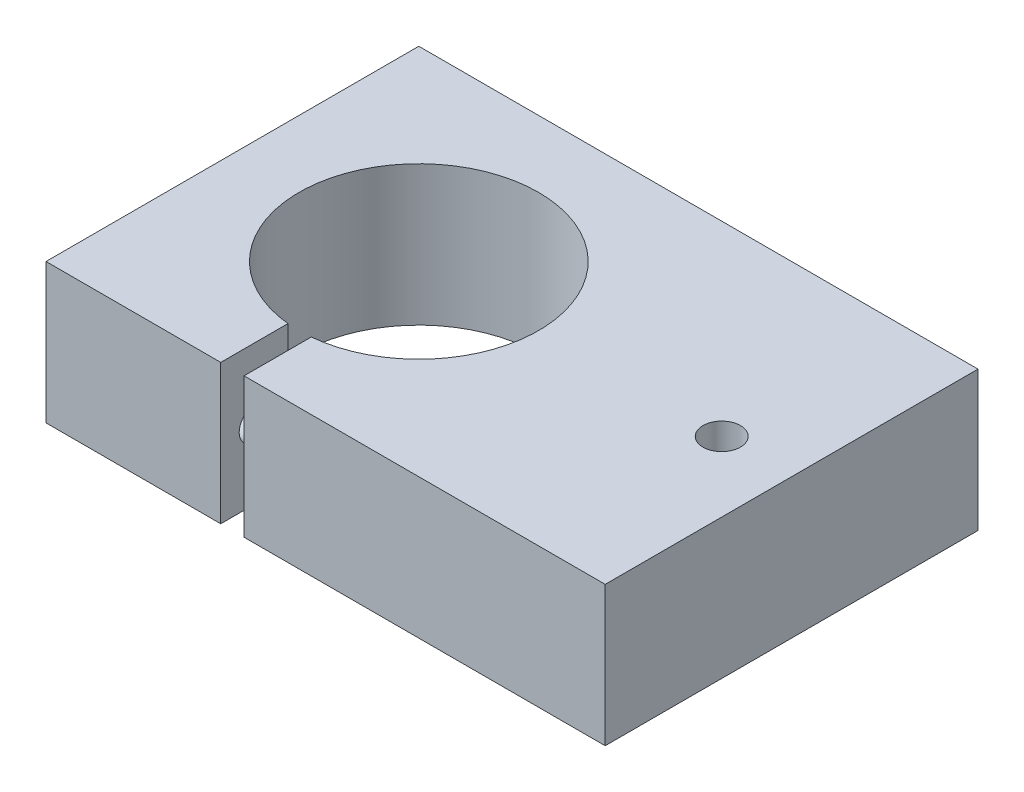
ISO-10303-21;
HEADER;
FILE_DESCRIPTION(('STEP AP214'),'2;1');
FILE_NAME('part.step','',(''),(''),'','','');
FILE_SCHEMA(('AUTOMOTIVE_DESIGN { 1 0 10303 214 1 1 1 1 }'));
ENDSEC;
DATA;
#1=APPLICATION_CONTEXT('core data for automotive mechanical design processes');
#2=APPLICATION_PROTOCOL_DEFINITION('international standard','automotive_design',2000,#1);
#3=PRODUCT_CONTEXT('',#1,'mechanical');
#4=PRODUCT('Part','Part','',(#3));
#5=PRODUCT_RELATED_PRODUCT_CATEGORY('part','',(#4));
#6=PRODUCT_DEFINITION_FORMATION('','',#4);
#7=PRODUCT_DEFINITION_CONTEXT('part definition',#1,'design');
#8=PRODUCT_DEFINITION('design','',#6,#7);
#9=PRODUCT_DEFINITION_SHAPE('','',#8);
#10=(LENGTH_UNIT() NAMED_UNIT(*) SI_UNIT(.MILLI.,.METRE.));
#11=(NAMED_UNIT(*) PLANE_ANGLE_UNIT() SI_UNIT($,.RADIAN.));
#12=(NAMED_UNIT(*) SI_UNIT($,.STERADIAN.) SOLID_ANGLE_UNIT());
#13=UNCERTAINTY_MEASURE_WITH_UNIT(LENGTH_MEASURE(1.E-05),#10,'distance_accuracy_value','');
#14=(GEOMETRIC_REPRESENTATION_CONTEXT(3) GLOBAL_UNCERTAINTY_ASSIGNED_CONTEXT((#13)) GLOBAL_UNIT_ASSIGNED_CONTEXT((#10,
#11,#12)) REPRESENTATION_CONTEXT('',''));
#15=CARTESIAN_POINT('',(0.,0.,0.));
#16=DIRECTION('',(0.,0.,1.));
#17=DIRECTION('',(1.,0.,0.));
#18=AXIS2_PLACEMENT_3D('',#15,#16,#17);
#19=CARTESIAN_POINT('',(-38.1,9.525,25.4));
#20=DIRECTION('',(0.,0.,-1.));
#21=DIRECTION('',(-1.,0.,0.));
#22=AXIS2_PLACEMENT_3D('',#19,#20,#21);
#23=PLANE('',#22);
#24=DIRECTION('',(1.,0.,0.));
#25=VECTOR('',#24,1.);
#26=CARTESIAN_POINT('',(-38.1,-9.525,25.4));
#27=LINE('',#26,#25);
#28=CARTESIAN_POINT('',(-38.1,-9.525,25.4));
#29=VERTEX_POINT('',#28);
#30=CARTESIAN_POINT('',(-14.2875,-9.525,25.4));
#31=VERTEX_POINT('',#30);
#32=EDGE_CURVE('E177',#29,#31,#27,.T.);
#33=ORIENTED_EDGE('',*,*,#32,.T.);
#34=DIRECTION('',(0.,1.,0.));
#35=VECTOR('',#34,1.);
#36=CARTESIAN_POINT('',(-14.2875,9.525,25.4));
#37=LINE('',#36,#35);
#38=CARTESIAN_POINT('',(-14.2875,9.525,25.4));
#39=VERTEX_POINT('',#38);
#40=EDGE_CURVE('E159',#31,#39,#37,.T.);
#41=ORIENTED_EDGE('',*,*,#40,.T.);
#42=DIRECTION('',(1.,0.,0.));
#43=VECTOR('',#42,1.);
#44=CARTESIAN_POINT('',(-38.1,9.525,25.4));
#45=LINE('',#44,#43);
#46=CARTESIAN_POINT('',(-38.1,9.525,25.4));
#47=VERTEX_POINT('',#46);
#48=EDGE_CURVE('E185',#47,#39,#45,.T.);
#49=ORIENTED_EDGE('',*,*,#48,.F.);
#50=DIRECTION('',(0.,-1.,0.));
#51=VECTOR('',#50,1.);
#52=CARTESIAN_POINT('',(-38.1,9.525,25.4));
#53=LINE('',#52,#51);
#54=EDGE_CURVE('E205',#47,#29,#53,.T.);
#55=ORIENTED_EDGE('',*,*,#54,.T.);
#56=EDGE_LOOP('',(#33,#41,#49,#55));
#57=FACE_BOUND('',#56,.T.);
#58=ADVANCED_FACE('F43',(#57),#23,.F.);
#59=CARTESIAN_POINT('',(-38.1,9.525,25.4));
#60=DIRECTION('',(-1.,0.,0.));
#61=DIRECTION('',(0.,0.,1.));
#62=AXIS2_PLACEMENT_3D('',#59,#60,#61);
#63=PLANE('',#62);
#64=CARTESIAN_POINT('',(-38.1,0.,20.6375));
#65=DIRECTION('',(-1.,0.,0.));
#66=DIRECTION('',(0.,0.,1.));
#67=AXIS2_PLACEMENT_3D('',#64,#65,#66);
#68=CIRCLE('',#67,3.96875);
#69=CARTESIAN_POINT('',(-38.1,0.,24.60625));
#70=VERTEX_POINT('',#69);
#71=EDGE_CURVE('E120',#70,#70,#68,.T.);
#72=ORIENTED_EDGE('',*,*,#71,.F.);
#73=EDGE_LOOP('',(#72));
#74=FACE_BOUND('',#73,.T.);
#75=DIRECTION('',(0.,0.,-1.));
#76=VECTOR('',#75,1.);
#77=CARTESIAN_POINT('',(-38.1,-9.525,25.4));
#78=LINE('',#77,#76);
#79=CARTESIAN_POINT('',(-38.1,-9.525,-25.4));
#80=VERTEX_POINT('',#79);
#81=EDGE_CURVE('E168',#29,#80,#78,.T.);
#82=ORIENTED_EDGE('',*,*,#81,.F.);
#83=ORIENTED_EDGE('',*,*,#54,.F.);
#84=DIRECTION('',(0.,0.,-1.));
#85=VECTOR('',#84,1.);
#86=CARTESIAN_POINT('',(-38.1,9.525,25.4));
#87=LINE('',#86,#85);
#88=CARTESIAN_POINT('',(-38.1,9.525,-25.4));
#89=VERTEX_POINT('',#88);
#90=EDGE_CURVE('E172',#47,#89,#87,.T.);
#91=ORIENTED_EDGE('',*,*,#90,.T.);
#92=DIRECTION('',(0.,-1.,0.));
#93=VECTOR('',#92,1.);
#94=CARTESIAN_POINT('',(-38.1,9.525,-25.4));
#95=LINE('',#94,#93);
#96=EDGE_CURVE('E189',#89,#80,#95,.T.);
#97=ORIENTED_EDGE('',*,*,#96,.T.);
#98=EDGE_LOOP('',(#82,#83,#91,#97));
#99=FACE_BOUND('',#98,.T.);
#100=ADVANCED_FACE('F45',(#74,#99),#63,.T.);
#101=CARTESIAN_POINT('',(-11.1125,9.525,25.4));
#102=VERTEX_POINT('',#101);
#103=CARTESIAN_POINT('',(38.1,9.525,25.4));
#104=VERTEX_POINT('',#103);
#105=EDGE_CURVE('E184',#102,#104,#45,.T.);
#106=ORIENTED_EDGE('',*,*,#105,.F.);
#107=DIRECTION('',(0.,-1.,0.));
#108=VECTOR('',#107,1.);
#109=CARTESIAN_POINT('',(-11.1125,9.525,25.4));
#110=LINE('',#109,#108);
#111=CARTESIAN_POINT('',(-11.1125,-9.525,25.4));
#112=VERTEX_POINT('',#111);
#113=EDGE_CURVE('E151',#102,#112,#110,.T.);
#114=ORIENTED_EDGE('',*,*,#113,.T.);
#115=CARTESIAN_POINT('',(38.1,-9.525,25.4));
#116=VERTEX_POINT('',#115);
#117=EDGE_CURVE('E201',#112,#116,#27,.T.);
#118=ORIENTED_EDGE('',*,*,#117,.T.);
#119=DIRECTION('',(0.,-1.,0.));
#120=VECTOR('',#119,1.);
#121=CARTESIAN_POINT('',(38.1,9.525,25.4));
#122=LINE('',#121,#120);
#123=EDGE_CURVE('E208',#104,#116,#122,.T.);
#124=ORIENTED_EDGE('',*,*,#123,.F.);
#125=EDGE_LOOP('',(#106,#114,#118,#124));
#126=FACE_BOUND('',#125,.T.);
#127=ADVANCED_FACE('F246',(#126),#23,.F.);
#128=CARTESIAN_POINT('',(38.1,9.525,25.4));
#129=DIRECTION('',(-1.,0.,0.));
#130=DIRECTION('',(0.,0.,1.));
#131=AXIS2_PLACEMENT_3D('',#128,#129,#130);
#132=PLANE('',#131);
#133=DIRECTION('',(0.,0.,-1.));
#134=VECTOR('',#133,1.);
#135=CARTESIAN_POINT('',(38.1,-9.525,25.4));
#136=LINE('',#135,#134);
#137=CARTESIAN_POINT('',(38.1,-9.525,-25.4));
#138=VERTEX_POINT('',#137);
#139=EDGE_CURVE('E197',#116,#138,#136,.T.);
#140=ORIENTED_EDGE('',*,*,#139,.T.);
#141=DIRECTION('',(0.,-1.,0.));
#142=VECTOR('',#141,1.);
#143=CARTESIAN_POINT('',(38.1,9.525,-25.4));
#144=LINE('',#143,#142);
#145=CARTESIAN_POINT('',(38.1,9.525,-25.4));
#146=VERTEX_POINT('',#145);
#147=EDGE_CURVE('E212',#146,#138,#144,.T.);
#148=ORIENTED_EDGE('',*,*,#147,.F.);
#149=DIRECTION('',(0.,0.,-1.));
#150=VECTOR('',#149,1.);
#151=CARTESIAN_POINT('',(38.1,9.525,25.4));
#152=LINE('',#151,#150);
#153=EDGE_CURVE('E181',#104,#146,#152,.T.);
#154=ORIENTED_EDGE('',*,*,#153,.F.);
#155=ORIENTED_EDGE('',*,*,#123,.T.);
#156=EDGE_LOOP('',(#140,#148,#154,#155));
#157=FACE_BOUND('',#156,.T.);
#158=ADVANCED_FACE('F242',(#157),#132,.F.);
#159=CARTESIAN_POINT('',(-38.1,9.525,-25.4));
#160=DIRECTION('',(0.,0.,-1.));
#161=DIRECTION('',(-1.,0.,0.));
#162=AXIS2_PLACEMENT_3D('',#159,#160,#161);
#163=PLANE('',#162);
#164=DIRECTION('',(1.,0.,0.));
#165=VECTOR('',#164,1.);
#166=CARTESIAN_POINT('',(-38.1,-9.525,-25.4));
#167=LINE('',#166,#165);
#168=EDGE_CURVE('E193',#80,#138,#167,.T.);
#169=ORIENTED_EDGE('',*,*,#168,.F.);
#170=ORIENTED_EDGE('',*,*,#96,.F.);
#171=DIRECTION('',(1.,0.,0.));
#172=VECTOR('',#171,1.);
#173=CARTESIAN_POINT('',(-38.1,9.525,-25.4));
#174=LINE('',#173,#172);
#175=EDGE_CURVE('E176',#89,#146,#174,.T.);
#176=ORIENTED_EDGE('',*,*,#175,.T.);
#177=ORIENTED_EDGE('',*,*,#147,.T.);
#178=EDGE_LOOP('',(#169,#170,#176,#177));
#179=FACE_BOUND('',#178,.T.);
#180=ADVANCED_FACE('F237',(#179),#163,.T.);
#181=CARTESIAN_POINT('',(0.,9.525,0.));
#182=DIRECTION('',(0.,-1.,0.));
#183=DIRECTION('',(0.,0.,-1.));
#184=AXIS2_PLACEMENT_3D('',#181,#182,#183);
#185=PLANE('',#184);
#186=CARTESIAN_POINT('',(28.575,9.525,0.));
#187=DIRECTION('',(0.,1.,0.));
#188=DIRECTION('',(0.,0.,1.));
#189=AXIS2_PLACEMENT_3D('',#186,#187,#188);
#190=CIRCLE('',#189,2.55269999999999);
#191=CARTESIAN_POINT('',(28.575,9.525,2.55269999999999));
#192=VERTEX_POINT('',#191);
#193=EDGE_CURVE('E289',#192,#192,#190,.T.);
#194=ORIENTED_EDGE('',*,*,#193,.F.);
#195=EDGE_LOOP('',(#194));
#196=FACE_BOUND('',#195,.T.);
#197=ORIENTED_EDGE('',*,*,#48,.T.);
#198=DIRECTION('',(0.,0.,1.));
#199=VECTOR('',#198,1.);
#200=CARTESIAN_POINT('',(-14.2875,9.525,28.0193952357561));
#201=LINE('',#200,#199);
#202=CARTESIAN_POINT('',(-14.2875,9.525,16.2421034352081));
#203=VERTEX_POINT('',#202);
#204=EDGE_CURVE('E144',#203,#39,#201,.T.);
#205=ORIENTED_EDGE('',*,*,#204,.F.);
#206=CARTESIAN_POINT('',(-12.7,9.525,0.));
#207=DIRECTION('',(0.,1.,0.));
#208=DIRECTION('',(0.,0.,1.));
#209=AXIS2_PLACEMENT_3D('',#206,#207,#208);
#210=CIRCLE('',#209,16.3195);
#211=CARTESIAN_POINT('',(-11.1125,9.525,16.2421034352081));
#212=VERTEX_POINT('',#211);
#213=EDGE_CURVE('E163',#212,#203,#210,.T.);
#214=ORIENTED_EDGE('',*,*,#213,.F.);
#215=DIRECTION('',(0.,0.,-1.));
#216=VECTOR('',#215,1.);
#217=CARTESIAN_POINT('',(-11.1125,9.525,28.0193952357561));
#218=LINE('',#217,#216);
#219=EDGE_CURVE('E59',#102,#212,#218,.T.);
#220=ORIENTED_EDGE('',*,*,#219,.F.);
#221=ORIENTED_EDGE('',*,*,#105,.T.);
#222=ORIENTED_EDGE('',*,*,#153,.T.);
#223=ORIENTED_EDGE('',*,*,#175,.F.);
#224=ORIENTED_EDGE('',*,*,#90,.F.);
#225=EDGE_LOOP('',(#197,#205,#214,#220,#221,#222,#223,#224));
#226=FACE_BOUND('',#225,.T.);
#227=ADVANCED_FACE('F223',(#196,#226),#185,.F.);
#228=CARTESIAN_POINT('',(0.,-9.525,0.));
#229=DIRECTION('',(0.,-1.,0.));
#230=DIRECTION('',(0.,0.,-1.));
#231=AXIS2_PLACEMENT_3D('',#228,#229,#230);
#232=PLANE('',#231);
#233=CARTESIAN_POINT('',(28.575,-9.525,0.));
#234=DIRECTION('',(0.,1.,0.));
#235=DIRECTION('',(0.,0.,1.));
#236=AXIS2_PLACEMENT_3D('',#233,#234,#235);
#237=CIRCLE('',#236,2.55269999999999);
#238=CARTESIAN_POINT('',(28.575,-9.525,2.55269999999999));
#239=VERTEX_POINT('',#238);
#240=EDGE_CURVE('E129',#239,#239,#237,.T.);
#241=ORIENTED_EDGE('',*,*,#240,.T.);
#242=EDGE_LOOP('',(#241));
#243=FACE_BOUND('',#242,.T.);
#244=DIRECTION('',(0.,0.,1.));
#245=VECTOR('',#244,1.);
#246=CARTESIAN_POINT('',(-14.2875,-9.525,28.0193952357561));
#247=LINE('',#246,#245);
#248=CARTESIAN_POINT('',(-14.2875,-9.525,16.2421034352081));
#249=VERTEX_POINT('',#248);
#250=EDGE_CURVE('E67',#249,#31,#247,.T.);
#251=ORIENTED_EDGE('',*,*,#250,.T.);
#252=ORIENTED_EDGE('',*,*,#32,.F.);
#253=ORIENTED_EDGE('',*,*,#81,.T.);
#254=ORIENTED_EDGE('',*,*,#168,.T.);
#255=ORIENTED_EDGE('',*,*,#139,.F.);
#256=ORIENTED_EDGE('',*,*,#117,.F.);
#257=DIRECTION('',(0.,0.,-1.));
#258=VECTOR('',#257,1.);
#259=CARTESIAN_POINT('',(-11.1125,-9.525,28.0193952357561));
#260=LINE('',#259,#258);
#261=CARTESIAN_POINT('',(-11.1125,-9.525,16.2421034352081));
#262=VERTEX_POINT('',#261);
#263=EDGE_CURVE('E147',#112,#262,#260,.T.);
#264=ORIENTED_EDGE('',*,*,#263,.T.);
#265=CARTESIAN_POINT('',(-12.7,-9.525,0.));
#266=DIRECTION('',(0.,1.,0.));
#267=DIRECTION('',(0.,0.,1.));
#268=AXIS2_PLACEMENT_3D('',#265,#266,#267);
#269=CIRCLE('',#268,16.3195);
#270=EDGE_CURVE('E164',#262,#249,#269,.T.);
#271=ORIENTED_EDGE('',*,*,#270,.T.);
#272=EDGE_LOOP('',(#251,#252,#253,#254,#255,#256,#264,#271));
#273=FACE_BOUND('',#272,.T.);
#274=ADVANCED_FACE('F232',(#243,#273),#232,.T.);
#275=CARTESIAN_POINT('',(-12.7,-9.525,0.));
#276=DIRECTION('',(0.,1.,0.));
#277=DIRECTION('',(0.,0.,1.));
#278=AXIS2_PLACEMENT_3D('',#275,#276,#277);
#279=CYLINDRICAL_SURFACE('',#278,16.3195);
#280=ORIENTED_EDGE('',*,*,#213,.T.);
#281=DIRECTION('',(0.,1.,0.));
#282=VECTOR('',#281,1.);
#283=CARTESIAN_POINT('',(-14.2875,-9.525,16.2421034352081));
#284=LINE('',#283,#282);
#285=EDGE_CURVE('E11',#203,#249,#284,.F.);
#286=ORIENTED_EDGE('',*,*,#285,.T.);
#287=ORIENTED_EDGE('',*,*,#270,.F.);
#288=DIRECTION('',(0.,1.,0.));
#289=VECTOR('',#288,1.);
#290=CARTESIAN_POINT('',(-11.1125,-9.525,16.2421034352081));
#291=LINE('',#290,#289);
#292=EDGE_CURVE('E52',#262,#212,#291,.T.);
#293=ORIENTED_EDGE('',*,*,#292,.T.);
#294=EDGE_LOOP('',(#280,#286,#287,#293));
#295=FACE_BOUND('',#294,.T.);
#296=ADVANCED_FACE('F220',(#295),#279,.F.);
#297=CARTESIAN_POINT('',(-11.1125,-9.525,28.0193952357561));
#298=DIRECTION('',(1.,0.,0.));
#299=DIRECTION('',(0.,0.,-1.));
#300=AXIS2_PLACEMENT_3D('',#297,#298,#299);
#301=PLANE('',#300);
#302=CARTESIAN_POINT('',(-11.1125,0.,20.6375));
#303=DIRECTION('',(-1.,0.,0.));
#304=DIRECTION('',(0.,0.,1.));
#305=AXIS2_PLACEMENT_3D('',#302,#303,#304);
#306=CIRCLE('',#305,1.7272);
#307=CARTESIAN_POINT('',(-11.1125,0.,22.3647));
#308=VERTEX_POINT('',#307);
#309=EDGE_CURVE('E121',#308,#308,#306,.T.);
#310=ORIENTED_EDGE('',*,*,#309,.F.);
#311=EDGE_LOOP('',(#310));
#312=FACE_BOUND('',#311,.T.);
#313=ORIENTED_EDGE('',*,*,#219,.T.);
#314=ORIENTED_EDGE('',*,*,#292,.F.);
#315=ORIENTED_EDGE('',*,*,#263,.F.);
#316=ORIENTED_EDGE('',*,*,#113,.F.);
#317=EDGE_LOOP('',(#313,#314,#315,#316));
#318=FACE_BOUND('',#317,.T.);
#319=ADVANCED_FACE('F249',(#312,#318),#301,.F.);
#320=CARTESIAN_POINT('',(-14.2875,-9.525,28.0193952357561));
#321=DIRECTION('',(-1.,0.,0.));
#322=DIRECTION('',(0.,0.,1.));
#323=AXIS2_PLACEMENT_3D('',#320,#321,#322);
#324=PLANE('',#323);
#325=CARTESIAN_POINT('',(-14.2875,0.,20.6375));
#326=DIRECTION('',(-1.,0.,0.));
#327=DIRECTION('',(0.,0.,1.));
#328=AXIS2_PLACEMENT_3D('',#325,#326,#327);
#329=CIRCLE('',#328,2.2479);
#330=CARTESIAN_POINT('',(-14.2875,0.,22.8854));
#331=VERTEX_POINT('',#330);
#332=EDGE_CURVE('E140',#331,#331,#329,.T.);
#333=ORIENTED_EDGE('',*,*,#332,.T.);
#334=EDGE_LOOP('',(#333));
#335=FACE_BOUND('',#334,.T.);
#336=ORIENTED_EDGE('',*,*,#250,.F.);
#337=ORIENTED_EDGE('',*,*,#285,.F.);
#338=ORIENTED_EDGE('',*,*,#204,.T.);
#339=ORIENTED_EDGE('',*,*,#40,.F.);
#340=EDGE_LOOP('',(#336,#337,#338,#339));
#341=FACE_BOUND('',#340,.T.);
#342=ADVANCED_FACE('F227',(#335,#341),#324,.F.);
#343=CARTESIAN_POINT('',(-38.1,0.,20.6375));
#344=DIRECTION('',(-1.,0.,0.));
#345=DIRECTION('',(0.,0.,1.));
#346=AXIS2_PLACEMENT_3D('',#343,#344,#345);
#347=CYLINDRICAL_SURFACE('',#346,2.2479);
#348=ORIENTED_EDGE('',*,*,#332,.F.);
#349=EDGE_LOOP('',(#348));
#350=FACE_BOUND('',#349,.T.);
#351=CARTESIAN_POINT('',(-33.9344,0.,20.6375));
#352=DIRECTION('',(-1.,0.,0.));
#353=DIRECTION('',(0.,0.,1.));
#354=AXIS2_PLACEMENT_3D('',#351,#352,#353);
#355=CIRCLE('',#354,2.2479);
#356=CARTESIAN_POINT('',(-33.9344,0.,22.8854));
#357=VERTEX_POINT('',#356);
#358=EDGE_CURVE('E136',#357,#357,#355,.T.);
#359=ORIENTED_EDGE('',*,*,#358,.T.);
#360=EDGE_LOOP('',(#359));
#361=FACE_BOUND('',#360,.T.);
#362=ADVANCED_FACE('F257',(#350,#361),#347,.F.);
#363=CARTESIAN_POINT('',(-33.9344,2.2479,20.6375));
#364=DIRECTION('',(1.,0.,0.));
#365=DIRECTION('',(0.,0.,-1.));
#366=AXIS2_PLACEMENT_3D('',#363,#364,#365);
#367=PLANE('',#366);
#368=ORIENTED_EDGE('',*,*,#358,.F.);
#369=EDGE_LOOP('',(#368));
#370=FACE_BOUND('',#369,.T.);
#371=CARTESIAN_POINT('',(-33.9344,0.,20.6375));
#372=DIRECTION('',(-1.,0.,0.));
#373=DIRECTION('',(0.,0.,1.));
#374=AXIS2_PLACEMENT_3D('',#371,#372,#373);
#375=CIRCLE('',#374,3.96875);
#376=CARTESIAN_POINT('',(-33.9344,0.,24.60625));
#377=VERTEX_POINT('',#376);
#378=EDGE_CURVE('E126',#377,#377,#375,.T.);
#379=ORIENTED_EDGE('',*,*,#378,.T.);
#380=EDGE_LOOP('',(#379));
#381=FACE_BOUND('',#380,.T.);
#382=ADVANCED_FACE('F307',(#370,#381),#367,.F.);
#383=CARTESIAN_POINT('',(-38.1,0.,20.6375));
#384=DIRECTION('',(-1.,0.,0.));
#385=DIRECTION('',(0.,0.,1.));
#386=AXIS2_PLACEMENT_3D('',#383,#384,#385);
#387=CYLINDRICAL_SURFACE('',#386,3.96875);
#388=ORIENTED_EDGE('',*,*,#378,.F.);
#389=EDGE_LOOP('',(#388));
#390=FACE_BOUND('',#389,.T.);
#391=ORIENTED_EDGE('',*,*,#71,.T.);
#392=EDGE_LOOP('',(#391));
#393=FACE_BOUND('',#392,.T.);
#394=ADVANCED_FACE('F113',(#390,#393),#387,.F.);
#395=CARTESIAN_POINT('',(1.5875,0.,20.6375));
#396=DIRECTION('',(-1.,0.,0.));
#397=DIRECTION('',(0.,0.,1.));
#398=AXIS2_PLACEMENT_3D('',#395,#396,#397);
#399=CONICAL_SURFACE('',#398,1.7272,1.02974425867665);
#400=CARTESIAN_POINT('',(2.6253064611844,0.,20.6375));
#401=VERTEX_POINT('',#400);
#402=VERTEX_LOOP('',#401);
#403=FACE_BOUND('',#402,.T.);
#404=CARTESIAN_POINT('',(1.5875,0.,20.6375));
#405=DIRECTION('',(-1.,0.,0.));
#406=DIRECTION('',(0.,0.,1.));
#407=AXIS2_PLACEMENT_3D('',#404,#405,#406);
#408=CIRCLE('',#407,1.7272);
#409=CARTESIAN_POINT('',(1.5875,0.,22.3647));
#410=VERTEX_POINT('',#409);
#411=EDGE_CURVE('E117',#410,#410,#408,.T.);
#412=ORIENTED_EDGE('',*,*,#411,.T.);
#413=EDGE_LOOP('',(#412));
#414=FACE_BOUND('',#413,.T.);
#415=ADVANCED_FACE('F109',(#403,#414),#399,.F.);
#416=CARTESIAN_POINT('',(-11.1125,0.,20.6375));
#417=DIRECTION('',(-1.,0.,0.));
#418=DIRECTION('',(0.,0.,1.));
#419=AXIS2_PLACEMENT_3D('',#416,#417,#418);
#420=CYLINDRICAL_SURFACE('',#419,1.7272);
#421=ORIENTED_EDGE('',*,*,#411,.F.);
#422=EDGE_LOOP('',(#421));
#423=FACE_BOUND('',#422,.T.);
#424=ORIENTED_EDGE('',*,*,#309,.T.);
#425=EDGE_LOOP('',(#424));
#426=FACE_BOUND('',#425,.T.);
#427=ADVANCED_FACE('F112',(#423,#426),#420,.F.);
#428=CARTESIAN_POINT('',(28.575,9.525,0.));
#429=DIRECTION('',(0.,1.,0.));
#430=DIRECTION('',(0.,0.,1.));
#431=AXIS2_PLACEMENT_3D('',#428,#429,#430);
#432=CYLINDRICAL_SURFACE('',#431,2.55269999999999);
#433=ORIENTED_EDGE('',*,*,#240,.F.);
#434=EDGE_LOOP('',(#433));
#435=FACE_BOUND('',#434,.T.);
#436=ORIENTED_EDGE('',*,*,#193,.T.);
#437=EDGE_LOOP('',(#436));
#438=FACE_BOUND('',#437,.T.);
#439=ADVANCED_FACE('F297',(#435,#438),#432,.F.);
#440=CLOSED_SHELL('',(#58,#100,#127,#158,#180,#227,#274,#296,#319,#342,#362,#382,#394,#415,#427,#439));
#441=MANIFOLD_SOLID_BREP('B2',#440);
#442=ADVANCED_BREP_SHAPE_REPRESENTATION('',(#18,#441),#14);
#443=SHAPE_DEFINITION_REPRESENTATION(#9,#442);
ENDSEC;
END-ISO-10303-21;
